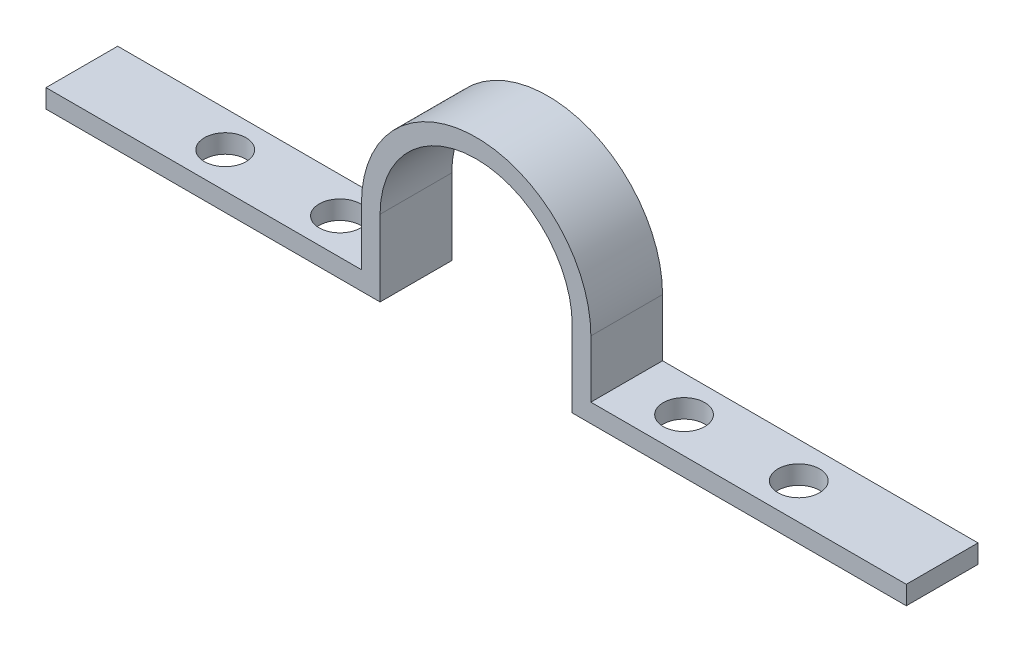
ISO-10303-21;
HEADER;
FILE_DESCRIPTION(('STEP AP214'),'2;1');
FILE_NAME('part.step','',(''),(''),'','','');
FILE_SCHEMA(('AUTOMOTIVE_DESIGN { 1 0 10303 214 1 1 1 1 }'));
ENDSEC;
DATA;
#1=APPLICATION_CONTEXT('core data for automotive mechanical design processes');
#2=APPLICATION_PROTOCOL_DEFINITION('international standard','automotive_design',2000,#1);
#3=PRODUCT_CONTEXT('',#1,'mechanical');
#4=PRODUCT('Part','Part','',(#3));
#5=PRODUCT_RELATED_PRODUCT_CATEGORY('part','',(#4));
#6=PRODUCT_DEFINITION_FORMATION('','',#4);
#7=PRODUCT_DEFINITION_CONTEXT('part definition',#1,'design');
#8=PRODUCT_DEFINITION('design','',#6,#7);
#9=PRODUCT_DEFINITION_SHAPE('','',#8);
#10=(LENGTH_UNIT() NAMED_UNIT(*) SI_UNIT(.MILLI.,.METRE.));
#11=(NAMED_UNIT(*) PLANE_ANGLE_UNIT() SI_UNIT($,.RADIAN.));
#12=(NAMED_UNIT(*) SI_UNIT($,.STERADIAN.) SOLID_ANGLE_UNIT());
#13=UNCERTAINTY_MEASURE_WITH_UNIT(LENGTH_MEASURE(1.E-05),#10,'distance_accuracy_value','');
#14=(GEOMETRIC_REPRESENTATION_CONTEXT(3) GLOBAL_UNCERTAINTY_ASSIGNED_CONTEXT((#13)) GLOBAL_UNIT_ASSIGNED_CONTEXT((#10,
#11,#12)) REPRESENTATION_CONTEXT('',''));
#15=CARTESIAN_POINT('',(0.,0.,0.));
#16=DIRECTION('',(0.,0.,1.));
#17=DIRECTION('',(1.,0.,0.));
#18=AXIS2_PLACEMENT_3D('',#15,#16,#17);
#19=CARTESIAN_POINT('',(-150.,0.,25.));
#20=DIRECTION('',(0.,1.,0.));
#21=DIRECTION('',(-1.,0.,0.));
#22=AXIS2_PLACEMENT_3D('',#19,#20,#21);
#23=PLANE('',#22);
#24=CARTESIAN_POINT('',(-100.,0.,12.5));
#25=DIRECTION('',(0.,1.,0.));
#26=DIRECTION('',(0.,0.,1.));
#27=AXIS2_PLACEMENT_3D('',#24,#25,#26);
#28=CIRCLE('',#27,7.25);
#29=CARTESIAN_POINT('',(-100.,0.,19.75));
#30=VERTEX_POINT('',#29);
#31=EDGE_CURVE('E254',#30,#30,#28,.T.);
#32=ORIENTED_EDGE('',*,*,#31,.T.);
#33=EDGE_LOOP('',(#32));
#34=FACE_BOUND('',#33,.T.);
#35=CARTESIAN_POINT('',(-60.,0.,12.5));
#36=DIRECTION('',(0.,1.,0.));
#37=DIRECTION('',(0.,0.,1.));
#38=AXIS2_PLACEMENT_3D('',#35,#36,#37);
#39=CIRCLE('',#38,7.25);
#40=CARTESIAN_POINT('',(-60.,0.,19.75));
#41=VERTEX_POINT('',#40);
#42=EDGE_CURVE('E204',#41,#41,#39,.T.);
#43=ORIENTED_EDGE('',*,*,#42,.T.);
#44=EDGE_LOOP('',(#43));
#45=FACE_BOUND('',#44,.T.);
#46=DIRECTION('',(1.,0.,0.));
#47=VECTOR('',#46,1.);
#48=CARTESIAN_POINT('',(-150.,0.,0.));
#49=LINE('',#48,#47);
#50=CARTESIAN_POINT('',(-150.,0.,0.));
#51=VERTEX_POINT('',#50);
#52=CARTESIAN_POINT('',(-33.5,0.,0.));
#53=VERTEX_POINT('',#52);
#54=EDGE_CURVE('E154',#51,#53,#49,.T.);
#55=ORIENTED_EDGE('',*,*,#54,.T.);
#56=DIRECTION('',(0.,0.,-1.));
#57=VECTOR('',#56,1.);
#58=CARTESIAN_POINT('',(-33.5,0.,25.));
#59=LINE('',#58,#57);
#60=CARTESIAN_POINT('',(-33.5,0.,25.));
#61=VERTEX_POINT('',#60);
#62=EDGE_CURVE('E11',#61,#53,#59,.T.);
#63=ORIENTED_EDGE('',*,*,#62,.F.);
#64=DIRECTION('',(1.,0.,0.));
#65=VECTOR('',#64,1.);
#66=CARTESIAN_POINT('',(-150.,0.,25.));
#67=LINE('',#66,#65);
#68=CARTESIAN_POINT('',(-150.,0.,25.));
#69=VERTEX_POINT('',#68);
#70=EDGE_CURVE('E176',#69,#61,#67,.T.);
#71=ORIENTED_EDGE('',*,*,#70,.F.);
#72=DIRECTION('',(0.,0.,-1.));
#73=VECTOR('',#72,1.);
#74=CARTESIAN_POINT('',(-150.,0.,25.));
#75=LINE('',#74,#73);
#76=EDGE_CURVE('E150',#69,#51,#75,.T.);
#77=ORIENTED_EDGE('',*,*,#76,.T.);
#78=EDGE_LOOP('',(#55,#63,#71,#77));
#79=FACE_BOUND('',#78,.T.);
#80=ADVANCED_FACE('F32',(#34,#45,#79),#23,.F.);
#81=CARTESIAN_POINT('',(-33.5,26.4999999999998,25.));
#82=DIRECTION('',(-1.,0.,0.));
#83=DIRECTION('',(0.,0.,1.));
#84=AXIS2_PLACEMENT_3D('',#81,#82,#83);
#85=PLANE('',#84);
#86=DIRECTION('',(0.,1.,0.));
#87=VECTOR('',#86,1.);
#88=CARTESIAN_POINT('',(-33.5,26.4999999999998,0.));
#89=LINE('',#88,#87);
#90=CARTESIAN_POINT('',(-33.5,26.4999999999998,0.));
#91=VERTEX_POINT('',#90);
#92=EDGE_CURVE('E157',#53,#91,#89,.T.);
#93=ORIENTED_EDGE('',*,*,#92,.T.);
#94=DIRECTION('',(0.,0.,-1.));
#95=VECTOR('',#94,1.);
#96=CARTESIAN_POINT('',(-33.5,26.4999999999998,25.));
#97=LINE('',#96,#95);
#98=CARTESIAN_POINT('',(-33.5,26.4999999999998,25.));
#99=VERTEX_POINT('',#98);
#100=EDGE_CURVE('E41',#99,#91,#97,.T.);
#101=ORIENTED_EDGE('',*,*,#100,.F.);
#102=DIRECTION('',(0.,1.,0.));
#103=VECTOR('',#102,1.);
#104=CARTESIAN_POINT('',(-33.5,26.4999999999998,25.));
#105=LINE('',#104,#103);
#106=EDGE_CURVE('E105',#61,#99,#105,.T.);
#107=ORIENTED_EDGE('',*,*,#106,.F.);
#108=ORIENTED_EDGE('',*,*,#62,.T.);
#109=EDGE_LOOP('',(#93,#101,#107,#108));
#110=FACE_BOUND('',#109,.T.);
#111=ADVANCED_FACE('F291',(#110),#85,.F.);
#112=CARTESIAN_POINT('',(0.,26.5000000000001,25.));
#113=DIRECTION('',(0.,0.,-1.));
#114=DIRECTION('',(-1.,0.,0.));
#115=AXIS2_PLACEMENT_3D('',#112,#113,#114);
#116=CYLINDRICAL_SURFACE('',#115,33.5);
#117=CARTESIAN_POINT('',(0.,26.5000000000001,0.));
#118=DIRECTION('',(0.,0.,-1.));
#119=DIRECTION('',(1.,0.,0.));
#120=AXIS2_PLACEMENT_3D('',#117,#118,#119);
#121=CIRCLE('',#120,33.5);
#122=CARTESIAN_POINT('',(33.5,26.5000000000001,0.));
#123=VERTEX_POINT('',#122);
#124=EDGE_CURVE('E159',#91,#123,#121,.T.);
#125=ORIENTED_EDGE('',*,*,#124,.T.);
#126=DIRECTION('',(0.,0.,-1.));
#127=VECTOR('',#126,1.);
#128=CARTESIAN_POINT('',(33.5,26.5000000000001,25.));
#129=LINE('',#128,#127);
#130=CARTESIAN_POINT('',(33.5,26.5000000000001,25.));
#131=VERTEX_POINT('',#130);
#132=EDGE_CURVE('E195',#131,#123,#129,.T.);
#133=ORIENTED_EDGE('',*,*,#132,.F.);
#134=CARTESIAN_POINT('',(0.,26.5000000000001,25.));
#135=DIRECTION('',(0.,0.,-1.));
#136=DIRECTION('',(1.,0.,0.));
#137=AXIS2_PLACEMENT_3D('',#134,#135,#136);
#138=CIRCLE('',#137,33.5);
#139=EDGE_CURVE('E248',#99,#131,#138,.T.);
#140=ORIENTED_EDGE('',*,*,#139,.F.);
#141=ORIENTED_EDGE('',*,*,#100,.T.);
#142=EDGE_LOOP('',(#125,#133,#140,#141));
#143=FACE_BOUND('',#142,.T.);
#144=ADVANCED_FACE('F295',(#143),#116,.F.);
#145=CARTESIAN_POINT('',(33.5,26.5000000000001,25.));
#146=DIRECTION('',(1.,0.,0.));
#147=DIRECTION('',(0.,0.,-1.));
#148=AXIS2_PLACEMENT_3D('',#145,#146,#147);
#149=PLANE('',#148);
#150=DIRECTION('',(0.,-1.,0.));
#151=VECTOR('',#150,1.);
#152=CARTESIAN_POINT('',(33.5,26.5000000000001,0.));
#153=LINE('',#152,#151);
#154=CARTESIAN_POINT('',(33.5,0.,0.));
#155=VERTEX_POINT('',#154);
#156=EDGE_CURVE('E161',#123,#155,#153,.T.);
#157=ORIENTED_EDGE('',*,*,#156,.T.);
#158=DIRECTION('',(0.,0.,-1.));
#159=VECTOR('',#158,1.);
#160=CARTESIAN_POINT('',(33.5,0.,25.));
#161=LINE('',#160,#159);
#162=CARTESIAN_POINT('',(33.5,0.,25.));
#163=VERTEX_POINT('',#162);
#164=EDGE_CURVE('E192',#163,#155,#161,.T.);
#165=ORIENTED_EDGE('',*,*,#164,.F.);
#166=DIRECTION('',(0.,-1.,0.));
#167=VECTOR('',#166,1.);
#168=CARTESIAN_POINT('',(33.5,26.5000000000001,25.));
#169=LINE('',#168,#167);
#170=EDGE_CURVE('E246',#131,#163,#169,.T.);
#171=ORIENTED_EDGE('',*,*,#170,.F.);
#172=ORIENTED_EDGE('',*,*,#132,.T.);
#173=EDGE_LOOP('',(#157,#165,#171,#172));
#174=FACE_BOUND('',#173,.T.);
#175=ADVANCED_FACE('F299',(#174),#149,.F.);
#176=CARTESIAN_POINT('',(150.,0.,25.));
#177=DIRECTION('',(0.,1.,0.));
#178=DIRECTION('',(-1.,0.,0.));
#179=AXIS2_PLACEMENT_3D('',#176,#177,#178);
#180=PLANE('',#179);
#181=CARTESIAN_POINT('',(100.,0.,12.5));
#182=DIRECTION('',(0.,1.,0.));
#183=DIRECTION('',(0.,0.,-1.));
#184=AXIS2_PLACEMENT_3D('',#181,#182,#183);
#185=CIRCLE('',#184,7.25);
#186=CARTESIAN_POINT('',(100.,0.,5.25));
#187=VERTEX_POINT('',#186);
#188=EDGE_CURVE('E255',#187,#187,#185,.T.);
#189=ORIENTED_EDGE('',*,*,#188,.T.);
#190=EDGE_LOOP('',(#189));
#191=FACE_BOUND('',#190,.T.);
#192=CARTESIAN_POINT('',(60.,0.,12.5));
#193=DIRECTION('',(0.,1.,0.));
#194=DIRECTION('',(0.,0.,-1.));
#195=AXIS2_PLACEMENT_3D('',#192,#193,#194);
#196=CIRCLE('',#195,7.25);
#197=CARTESIAN_POINT('',(60.,0.,5.25));
#198=VERTEX_POINT('',#197);
#199=EDGE_CURVE('E258',#198,#198,#196,.T.);
#200=ORIENTED_EDGE('',*,*,#199,.T.);
#201=EDGE_LOOP('',(#200));
#202=FACE_BOUND('',#201,.T.);
#203=DIRECTION('',(1.,0.,0.));
#204=VECTOR('',#203,1.);
#205=CARTESIAN_POINT('',(150.,0.,0.));
#206=LINE('',#205,#204);
#207=CARTESIAN_POINT('',(150.,0.,0.));
#208=VERTEX_POINT('',#207);
#209=EDGE_CURVE('E163',#155,#208,#206,.T.);
#210=ORIENTED_EDGE('',*,*,#209,.T.);
#211=DIRECTION('',(0.,0.,-1.));
#212=VECTOR('',#211,1.);
#213=CARTESIAN_POINT('',(150.,0.,25.));
#214=LINE('',#213,#212);
#215=CARTESIAN_POINT('',(150.,0.,25.));
#216=VERTEX_POINT('',#215);
#217=EDGE_CURVE('E189',#216,#208,#214,.T.);
#218=ORIENTED_EDGE('',*,*,#217,.F.);
#219=DIRECTION('',(1.,0.,0.));
#220=VECTOR('',#219,1.);
#221=CARTESIAN_POINT('',(150.,0.,25.));
#222=LINE('',#221,#220);
#223=EDGE_CURVE('E244',#163,#216,#222,.T.);
#224=ORIENTED_EDGE('',*,*,#223,.F.);
#225=ORIENTED_EDGE('',*,*,#164,.T.);
#226=EDGE_LOOP('',(#210,#218,#224,#225));
#227=FACE_BOUND('',#226,.T.);
#228=ADVANCED_FACE('F305',(#191,#202,#227),#180,.F.);
#229=CARTESIAN_POINT('',(150.,0.,25.));
#230=DIRECTION('',(-1.,0.,0.));
#231=DIRECTION('',(0.,-1.,0.));
#232=AXIS2_PLACEMENT_3D('',#229,#230,#231);
#233=PLANE('',#232);
#234=DIRECTION('',(0.,1.,0.));
#235=VECTOR('',#234,1.);
#236=CARTESIAN_POINT('',(150.,0.,0.));
#237=LINE('',#236,#235);
#238=CARTESIAN_POINT('',(150.,6.50000000000008,0.));
#239=VERTEX_POINT('',#238);
#240=EDGE_CURVE('E165',#208,#239,#237,.T.);
#241=ORIENTED_EDGE('',*,*,#240,.T.);
#242=DIRECTION('',(0.,0.,-1.));
#243=VECTOR('',#242,1.);
#244=CARTESIAN_POINT('',(150.,6.50000000000008,25.));
#245=LINE('',#244,#243);
#246=CARTESIAN_POINT('',(150.,6.50000000000008,25.));
#247=VERTEX_POINT('',#246);
#248=EDGE_CURVE('E186',#247,#239,#245,.T.);
#249=ORIENTED_EDGE('',*,*,#248,.F.);
#250=DIRECTION('',(0.,1.,0.));
#251=VECTOR('',#250,1.);
#252=CARTESIAN_POINT('',(150.,0.,25.));
#253=LINE('',#252,#251);
#254=EDGE_CURVE('E242',#216,#247,#253,.T.);
#255=ORIENTED_EDGE('',*,*,#254,.F.);
#256=ORIENTED_EDGE('',*,*,#217,.T.);
#257=EDGE_LOOP('',(#241,#249,#255,#256));
#258=FACE_BOUND('',#257,.T.);
#259=ADVANCED_FACE('F219',(#258),#233,.F.);
#260=CARTESIAN_POINT('',(150.,6.50000000000008,25.));
#261=DIRECTION('',(0.,-1.,0.));
#262=DIRECTION('',(1.,0.,0.));
#263=AXIS2_PLACEMENT_3D('',#260,#261,#262);
#264=PLANE('',#263);
#265=CARTESIAN_POINT('',(100.,6.50000000000007,12.5));
#266=DIRECTION('',(0.,-1.,0.));
#267=DIRECTION('',(1.,0.,0.));
#268=AXIS2_PLACEMENT_3D('',#265,#266,#267);
#269=CIRCLE('',#268,7.25);
#270=CARTESIAN_POINT('',(107.25,6.50000000000007,12.5));
#271=VERTEX_POINT('',#270);
#272=EDGE_CURVE('E35',#271,#271,#269,.F.);
#273=ORIENTED_EDGE('',*,*,#272,.F.);
#274=EDGE_LOOP('',(#273));
#275=FACE_BOUND('',#274,.T.);
#276=CARTESIAN_POINT('',(60.,6.50000000000006,12.5));
#277=DIRECTION('',(0.,-1.,0.));
#278=DIRECTION('',(1.,0.,0.));
#279=AXIS2_PLACEMENT_3D('',#276,#277,#278);
#280=CIRCLE('',#279,7.25);
#281=CARTESIAN_POINT('',(67.25,6.50000000000007,12.5));
#282=VERTEX_POINT('',#281);
#283=EDGE_CURVE('E206',#282,#282,#280,.F.);
#284=ORIENTED_EDGE('',*,*,#283,.F.);
#285=EDGE_LOOP('',(#284));
#286=FACE_BOUND('',#285,.T.);
#287=DIRECTION('',(-1.,0.,0.));
#288=VECTOR('',#287,1.);
#289=CARTESIAN_POINT('',(150.,6.50000000000008,0.));
#290=LINE('',#289,#288);
#291=CARTESIAN_POINT('',(40.,6.50000000000006,0.));
#292=VERTEX_POINT('',#291);
#293=EDGE_CURVE('E167',#239,#292,#290,.T.);
#294=ORIENTED_EDGE('',*,*,#293,.T.);
#295=DIRECTION('',(0.,0.,-1.));
#296=VECTOR('',#295,1.);
#297=CARTESIAN_POINT('',(40.,6.50000000000006,25.));
#298=LINE('',#297,#296);
#299=CARTESIAN_POINT('',(40.,6.50000000000006,25.));
#300=VERTEX_POINT('',#299);
#301=EDGE_CURVE('E183',#300,#292,#298,.T.);
#302=ORIENTED_EDGE('',*,*,#301,.F.);
#303=DIRECTION('',(-1.,0.,0.));
#304=VECTOR('',#303,1.);
#305=CARTESIAN_POINT('',(150.,6.50000000000008,25.));
#306=LINE('',#305,#304);
#307=EDGE_CURVE('E238',#247,#300,#306,.T.);
#308=ORIENTED_EDGE('',*,*,#307,.F.);
#309=ORIENTED_EDGE('',*,*,#248,.T.);
#310=EDGE_LOOP('',(#294,#302,#308,#309));
#311=FACE_BOUND('',#310,.T.);
#312=ADVANCED_FACE('F215',(#275,#286,#311),#264,.F.);
#313=CARTESIAN_POINT('',(40.,26.5000000000001,25.));
#314=DIRECTION('',(-1.,0.,0.));
#315=DIRECTION('',(0.,-1.,0.));
#316=AXIS2_PLACEMENT_3D('',#313,#314,#315);
#317=PLANE('',#316);
#318=DIRECTION('',(0.,1.,0.));
#319=VECTOR('',#318,1.);
#320=CARTESIAN_POINT('',(40.,26.5000000000001,0.));
#321=LINE('',#320,#319);
#322=CARTESIAN_POINT('',(40.,26.5000000000001,0.));
#323=VERTEX_POINT('',#322);
#324=EDGE_CURVE('E169',#292,#323,#321,.T.);
#325=ORIENTED_EDGE('',*,*,#324,.T.);
#326=DIRECTION('',(0.,0.,-1.));
#327=VECTOR('',#326,1.);
#328=CARTESIAN_POINT('',(40.,26.5000000000001,25.));
#329=LINE('',#328,#327);
#330=CARTESIAN_POINT('',(40.,26.5000000000001,25.));
#331=VERTEX_POINT('',#330);
#332=EDGE_CURVE('E180',#331,#323,#329,.T.);
#333=ORIENTED_EDGE('',*,*,#332,.F.);
#334=DIRECTION('',(0.,1.,0.));
#335=VECTOR('',#334,1.);
#336=CARTESIAN_POINT('',(40.,26.5000000000001,25.));
#337=LINE('',#336,#335);
#338=EDGE_CURVE('E232',#300,#331,#337,.T.);
#339=ORIENTED_EDGE('',*,*,#338,.F.);
#340=ORIENTED_EDGE('',*,*,#301,.T.);
#341=EDGE_LOOP('',(#325,#333,#339,#340));
#342=FACE_BOUND('',#341,.T.);
#343=ADVANCED_FACE('F218',(#342),#317,.F.);
#344=CARTESIAN_POINT('',(0.,26.5000000000001,25.));
#345=DIRECTION('',(0.,0.,-1.));
#346=DIRECTION('',(-1.,0.,0.));
#347=AXIS2_PLACEMENT_3D('',#344,#345,#346);
#348=CYLINDRICAL_SURFACE('',#347,40.);
#349=CARTESIAN_POINT('',(0.,26.5000000000001,0.));
#350=DIRECTION('',(0.,0.,1.));
#351=DIRECTION('',(1.,0.,0.));
#352=AXIS2_PLACEMENT_3D('',#349,#350,#351);
#353=CIRCLE('',#352,40.);
#354=CARTESIAN_POINT('',(-40.,26.4999999999998,0.));
#355=VERTEX_POINT('',#354);
#356=EDGE_CURVE('E171',#323,#355,#353,.T.);
#357=ORIENTED_EDGE('',*,*,#356,.T.);
#358=DIRECTION('',(0.,0.,-1.));
#359=VECTOR('',#358,1.);
#360=CARTESIAN_POINT('',(-40.,26.4999999999998,25.));
#361=LINE('',#360,#359);
#362=CARTESIAN_POINT('',(-40.,26.4999999999998,25.));
#363=VERTEX_POINT('',#362);
#364=EDGE_CURVE('E145',#363,#355,#361,.T.);
#365=ORIENTED_EDGE('',*,*,#364,.F.);
#366=CARTESIAN_POINT('',(0.,26.5000000000001,25.));
#367=DIRECTION('',(0.,0.,1.));
#368=DIRECTION('',(1.,0.,0.));
#369=AXIS2_PLACEMENT_3D('',#366,#367,#368);
#370=CIRCLE('',#369,40.);
#371=EDGE_CURVE('E136',#331,#363,#370,.T.);
#372=ORIENTED_EDGE('',*,*,#371,.F.);
#373=ORIENTED_EDGE('',*,*,#332,.T.);
#374=EDGE_LOOP('',(#357,#365,#372,#373));
#375=FACE_BOUND('',#374,.T.);
#376=ADVANCED_FACE('F237',(#375),#348,.T.);
#377=CARTESIAN_POINT('',(-40.,26.4999999999998,25.));
#378=DIRECTION('',(1.,0.,0.));
#379=DIRECTION('',(0.,0.,-1.));
#380=AXIS2_PLACEMENT_3D('',#377,#378,#379);
#381=PLANE('',#380);
#382=DIRECTION('',(0.,-1.,0.));
#383=VECTOR('',#382,1.);
#384=CARTESIAN_POINT('',(-40.,26.4999999999998,0.));
#385=LINE('',#384,#383);
#386=CARTESIAN_POINT('',(-40.,6.50000000000006,0.));
#387=VERTEX_POINT('',#386);
#388=EDGE_CURVE('E144',#355,#387,#385,.T.);
#389=ORIENTED_EDGE('',*,*,#388,.T.);
#390=DIRECTION('',(0.,0.,-1.));
#391=VECTOR('',#390,1.);
#392=CARTESIAN_POINT('',(-40.,6.50000000000006,25.));
#393=LINE('',#392,#391);
#394=CARTESIAN_POINT('',(-40.,6.50000000000006,25.));
#395=VERTEX_POINT('',#394);
#396=EDGE_CURVE('E141',#395,#387,#393,.T.);
#397=ORIENTED_EDGE('',*,*,#396,.F.);
#398=DIRECTION('',(0.,-1.,0.));
#399=VECTOR('',#398,1.);
#400=CARTESIAN_POINT('',(-40.,26.4999999999998,25.));
#401=LINE('',#400,#399);
#402=EDGE_CURVE('E130',#363,#395,#401,.T.);
#403=ORIENTED_EDGE('',*,*,#402,.F.);
#404=ORIENTED_EDGE('',*,*,#364,.T.);
#405=EDGE_LOOP('',(#389,#397,#403,#404));
#406=FACE_BOUND('',#405,.T.);
#407=ADVANCED_FACE('F142',(#406),#381,.F.);
#408=CARTESIAN_POINT('',(-40.,6.50000000000006,25.));
#409=DIRECTION('',(0.,-1.,0.));
#410=DIRECTION('',(1.,0.,0.));
#411=AXIS2_PLACEMENT_3D('',#408,#409,#410);
#412=PLANE('',#411);
#413=CARTESIAN_POINT('',(-100.,6.50000000000003,12.5));
#414=DIRECTION('',(0.,-1.,0.));
#415=DIRECTION('',(1.,0.,0.));
#416=AXIS2_PLACEMENT_3D('',#413,#414,#415);
#417=CIRCLE('',#416,7.25);
#418=CARTESIAN_POINT('',(-92.75,6.50000000000003,12.5));
#419=VERTEX_POINT('',#418);
#420=EDGE_CURVE('E203',#419,#419,#417,.F.);
#421=ORIENTED_EDGE('',*,*,#420,.F.);
#422=EDGE_LOOP('',(#421));
#423=FACE_BOUND('',#422,.T.);
#424=CARTESIAN_POINT('',(-60.,6.50000000000005,12.5));
#425=DIRECTION('',(0.,-1.,0.));
#426=DIRECTION('',(1.,0.,0.));
#427=AXIS2_PLACEMENT_3D('',#424,#425,#426);
#428=CIRCLE('',#427,7.25);
#429=CARTESIAN_POINT('',(-52.75,6.50000000000005,12.5));
#430=VERTEX_POINT('',#429);
#431=EDGE_CURVE('E200',#430,#430,#428,.F.);
#432=ORIENTED_EDGE('',*,*,#431,.F.);
#433=EDGE_LOOP('',(#432));
#434=FACE_BOUND('',#433,.T.);
#435=DIRECTION('',(-1.,0.,0.));
#436=VECTOR('',#435,1.);
#437=CARTESIAN_POINT('',(-40.,6.50000000000006,0.));
#438=LINE('',#437,#436);
#439=CARTESIAN_POINT('',(-150.,6.50000000000001,0.));
#440=VERTEX_POINT('',#439);
#441=EDGE_CURVE('E91',#387,#440,#438,.T.);
#442=ORIENTED_EDGE('',*,*,#441,.T.);
#443=DIRECTION('',(0.,0.,-1.));
#444=VECTOR('',#443,1.);
#445=CARTESIAN_POINT('',(-150.,6.50000000000001,25.));
#446=LINE('',#445,#444);
#447=CARTESIAN_POINT('',(-150.,6.50000000000001,25.));
#448=VERTEX_POINT('',#447);
#449=EDGE_CURVE('E146',#448,#440,#446,.T.);
#450=ORIENTED_EDGE('',*,*,#449,.F.);
#451=DIRECTION('',(-1.,0.,0.));
#452=VECTOR('',#451,1.);
#453=CARTESIAN_POINT('',(-40.,6.50000000000006,25.));
#454=LINE('',#453,#452);
#455=EDGE_CURVE('E134',#395,#448,#454,.T.);
#456=ORIENTED_EDGE('',*,*,#455,.F.);
#457=ORIENTED_EDGE('',*,*,#396,.T.);
#458=EDGE_LOOP('',(#442,#450,#456,#457));
#459=FACE_BOUND('',#458,.T.);
#460=ADVANCED_FACE('F148',(#423,#434,#459),#412,.F.);
#461=CARTESIAN_POINT('',(-150.,6.50000000000001,25.));
#462=DIRECTION('',(1.,0.,0.));
#463=DIRECTION('',(0.,0.,-1.));
#464=AXIS2_PLACEMENT_3D('',#461,#462,#463);
#465=PLANE('',#464);
#466=DIRECTION('',(0.,-1.,0.));
#467=VECTOR('',#466,1.);
#468=CARTESIAN_POINT('',(-150.,6.50000000000001,0.));
#469=LINE('',#468,#467);
#470=EDGE_CURVE('E97',#440,#51,#469,.T.);
#471=ORIENTED_EDGE('',*,*,#470,.T.);
#472=ORIENTED_EDGE('',*,*,#76,.F.);
#473=DIRECTION('',(0.,-1.,0.));
#474=VECTOR('',#473,1.);
#475=CARTESIAN_POINT('',(-150.,6.50000000000001,25.));
#476=LINE('',#475,#474);
#477=EDGE_CURVE('E50',#448,#69,#476,.T.);
#478=ORIENTED_EDGE('',*,*,#477,.F.);
#479=ORIENTED_EDGE('',*,*,#449,.T.);
#480=EDGE_LOOP('',(#471,#472,#478,#479));
#481=FACE_BOUND('',#480,.T.);
#482=ADVANCED_FACE('F276',(#481),#465,.F.);
#483=CARTESIAN_POINT('',(0.,26.5000000000001,25.));
#484=DIRECTION('',(0.,0.,1.));
#485=DIRECTION('',(1.,0.,0.));
#486=AXIS2_PLACEMENT_3D('',#483,#484,#485);
#487=PLANE('',#486);
#488=ORIENTED_EDGE('',*,*,#70,.T.);
#489=ORIENTED_EDGE('',*,*,#106,.T.);
#490=ORIENTED_EDGE('',*,*,#139,.T.);
#491=ORIENTED_EDGE('',*,*,#170,.T.);
#492=ORIENTED_EDGE('',*,*,#223,.T.);
#493=ORIENTED_EDGE('',*,*,#254,.T.);
#494=ORIENTED_EDGE('',*,*,#307,.T.);
#495=ORIENTED_EDGE('',*,*,#338,.T.);
#496=ORIENTED_EDGE('',*,*,#371,.T.);
#497=ORIENTED_EDGE('',*,*,#402,.T.);
#498=ORIENTED_EDGE('',*,*,#455,.T.);
#499=ORIENTED_EDGE('',*,*,#477,.T.);
#500=EDGE_LOOP('',(#488,#489,#490,#491,#492,#493,#494,#495,#496,#497,#498,#499));
#501=FACE_BOUND('',#500,.T.);
#502=ADVANCED_FACE('F132',(#501),#487,.T.);
#503=CARTESIAN_POINT('',(0.,26.5000000000001,0.));
#504=DIRECTION('',(0.,0.,1.));
#505=DIRECTION('',(1.,0.,0.));
#506=AXIS2_PLACEMENT_3D('',#503,#504,#505);
#507=PLANE('',#506);
#508=ORIENTED_EDGE('',*,*,#54,.F.);
#509=ORIENTED_EDGE('',*,*,#470,.F.);
#510=ORIENTED_EDGE('',*,*,#441,.F.);
#511=ORIENTED_EDGE('',*,*,#388,.F.);
#512=ORIENTED_EDGE('',*,*,#356,.F.);
#513=ORIENTED_EDGE('',*,*,#324,.F.);
#514=ORIENTED_EDGE('',*,*,#293,.F.);
#515=ORIENTED_EDGE('',*,*,#240,.F.);
#516=ORIENTED_EDGE('',*,*,#209,.F.);
#517=ORIENTED_EDGE('',*,*,#156,.F.);
#518=ORIENTED_EDGE('',*,*,#124,.F.);
#519=ORIENTED_EDGE('',*,*,#92,.F.);
#520=EDGE_LOOP('',(#508,#509,#510,#511,#512,#513,#514,#515,#516,#517,#518,#519));
#521=FACE_BOUND('',#520,.T.);
#522=ADVANCED_FACE('F235',(#521),#507,.F.);
#523=CARTESIAN_POINT('',(-60.,25.,12.5));
#524=DIRECTION('',(0.,-1.,0.));
#525=DIRECTION('',(0.,0.,-1.));
#526=AXIS2_PLACEMENT_3D('',#523,#524,#525);
#527=CYLINDRICAL_SURFACE('',#526,7.25);
#528=ORIENTED_EDGE('',*,*,#42,.F.);
#529=EDGE_LOOP('',(#528));
#530=FACE_BOUND('',#529,.T.);
#531=ORIENTED_EDGE('',*,*,#431,.T.);
#532=EDGE_LOOP('',(#531));
#533=FACE_BOUND('',#532,.T.);
#534=ADVANCED_FACE('F270',(#530,#533),#527,.F.);
#535=CARTESIAN_POINT('',(-100.,25.,12.5));
#536=DIRECTION('',(0.,-1.,0.));
#537=DIRECTION('',(0.,0.,-1.));
#538=AXIS2_PLACEMENT_3D('',#535,#536,#537);
#539=CYLINDRICAL_SURFACE('',#538,7.25);
#540=ORIENTED_EDGE('',*,*,#31,.F.);
#541=EDGE_LOOP('',(#540));
#542=FACE_BOUND('',#541,.T.);
#543=ORIENTED_EDGE('',*,*,#420,.T.);
#544=EDGE_LOOP('',(#543));
#545=FACE_BOUND('',#544,.T.);
#546=ADVANCED_FACE('F266',(#542,#545),#539,.F.);
#547=CARTESIAN_POINT('',(60.,25.,12.5));
#548=DIRECTION('',(0.,-1.,0.));
#549=DIRECTION('',(0.,0.,-1.));
#550=AXIS2_PLACEMENT_3D('',#547,#548,#549);
#551=CYLINDRICAL_SURFACE('',#550,7.25);
#552=ORIENTED_EDGE('',*,*,#199,.F.);
#553=EDGE_LOOP('',(#552));
#554=FACE_BOUND('',#553,.T.);
#555=ORIENTED_EDGE('',*,*,#283,.T.);
#556=EDGE_LOOP('',(#555));
#557=FACE_BOUND('',#556,.T.);
#558=ADVANCED_FACE('F269',(#554,#557),#551,.F.);
#559=CARTESIAN_POINT('',(100.,25.,12.5));
#560=DIRECTION('',(0.,-1.,0.));
#561=DIRECTION('',(0.,0.,-1.));
#562=AXIS2_PLACEMENT_3D('',#559,#560,#561);
#563=CYLINDRICAL_SURFACE('',#562,7.25);
#564=ORIENTED_EDGE('',*,*,#188,.F.);
#565=EDGE_LOOP('',(#564));
#566=FACE_BOUND('',#565,.T.);
#567=ORIENTED_EDGE('',*,*,#272,.T.);
#568=EDGE_LOOP('',(#567));
#569=FACE_BOUND('',#568,.T.);
#570=ADVANCED_FACE('F213',(#566,#569),#563,.F.);
#571=CLOSED_SHELL('',(#80,#111,#144,#175,#228,#259,#312,#343,#376,#407,#460,#482,#502,#522,#534,
#546,#558,#570));
#572=MANIFOLD_SOLID_BREP('B2',#571);
#573=ADVANCED_BREP_SHAPE_REPRESENTATION('',(#18,#572),#14);
#574=SHAPE_DEFINITION_REPRESENTATION(#9,#573);
ENDSEC;
END-ISO-10303-21;
